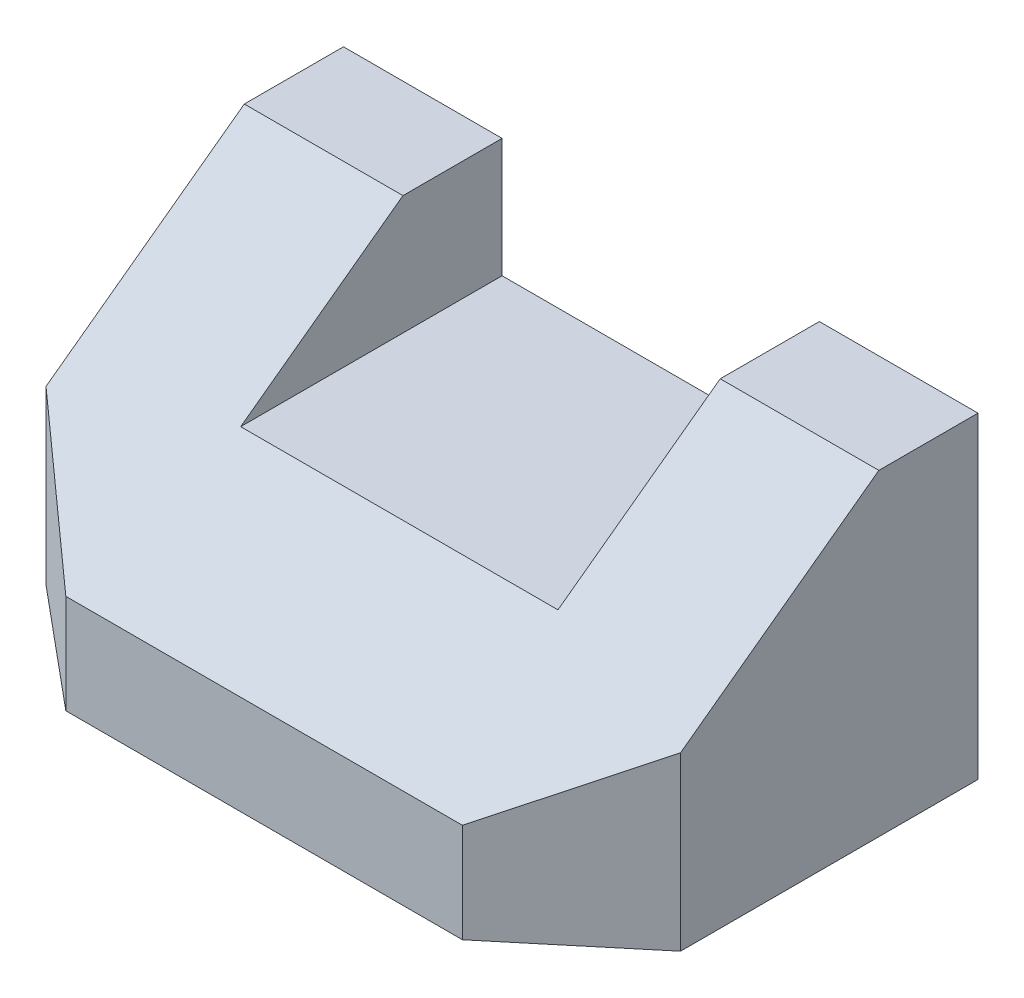
ISO-10303-21;
HEADER;
FILE_DESCRIPTION(('STEP AP214'),'2;1');
FILE_NAME('part.step','',(''),(''),'','','');
FILE_SCHEMA(('AUTOMOTIVE_DESIGN { 1 0 10303 214 1 1 1 1 }'));
ENDSEC;
DATA;
#1=APPLICATION_CONTEXT('core data for automotive mechanical design processes');
#2=APPLICATION_PROTOCOL_DEFINITION('international standard','automotive_design',2000,#1);
#3=PRODUCT_CONTEXT('',#1,'mechanical');
#4=PRODUCT('Part','Part','',(#3));
#5=PRODUCT_RELATED_PRODUCT_CATEGORY('part','',(#4));
#6=PRODUCT_DEFINITION_FORMATION('','',#4);
#7=PRODUCT_DEFINITION_CONTEXT('part definition',#1,'design');
#8=PRODUCT_DEFINITION('design','',#6,#7);
#9=PRODUCT_DEFINITION_SHAPE('','',#8);
#10=(LENGTH_UNIT() NAMED_UNIT(*) SI_UNIT(.MILLI.,.METRE.));
#11=(NAMED_UNIT(*) PLANE_ANGLE_UNIT() SI_UNIT($,.RADIAN.));
#12=(NAMED_UNIT(*) SI_UNIT($,.STERADIAN.) SOLID_ANGLE_UNIT());
#13=UNCERTAINTY_MEASURE_WITH_UNIT(LENGTH_MEASURE(1.E-05),#10,'distance_accuracy_value','');
#14=(GEOMETRIC_REPRESENTATION_CONTEXT(3) GLOBAL_UNCERTAINTY_ASSIGNED_CONTEXT((#13)) GLOBAL_UNIT_ASSIGNED_CONTEXT((#10,
#11,#12)) REPRESENTATION_CONTEXT('',''));
#15=CARTESIAN_POINT('',(0.,0.,0.));
#16=DIRECTION('',(0.,0.,1.));
#17=DIRECTION('',(1.,0.,0.));
#18=AXIS2_PLACEMENT_3D('',#15,#16,#17);
#19=CARTESIAN_POINT('',(32.,32.,-40.));
#20=DIRECTION('',(0.,0.,1.));
#21=DIRECTION('',(0.,-1.,0.));
#22=AXIS2_PLACEMENT_3D('',#19,#20,#21);
#23=PLANE('',#22);
#24=DIRECTION('',(0.,1.,0.));
#25=VECTOR('',#24,1.);
#26=CARTESIAN_POINT('',(-16.,32.,-40.));
#27=LINE('',#26,#25);
#28=CARTESIAN_POINT('',(-16.,20.,-40.));
#29=VERTEX_POINT('',#28);
#30=CARTESIAN_POINT('',(-16.,32.,-40.));
#31=VERTEX_POINT('',#30);
#32=EDGE_CURVE('E202',#29,#31,#27,.T.);
#33=ORIENTED_EDGE('',*,*,#32,.F.);
#34=DIRECTION('',(-1.,0.,0.));
#35=VECTOR('',#34,1.);
#36=CARTESIAN_POINT('',(-16.,20.,-40.));
#37=LINE('',#36,#35);
#38=CARTESIAN_POINT('',(16.,20.,-40.));
#39=VERTEX_POINT('',#38);
#40=EDGE_CURVE('E206',#39,#29,#37,.T.);
#41=ORIENTED_EDGE('',*,*,#40,.F.);
#42=DIRECTION('',(0.,-1.,0.));
#43=VECTOR('',#42,1.);
#44=CARTESIAN_POINT('',(16.,32.,-40.));
#45=LINE('',#44,#43);
#46=CARTESIAN_POINT('',(16.,32.,-40.));
#47=VERTEX_POINT('',#46);
#48=EDGE_CURVE('E204',#47,#39,#45,.T.);
#49=ORIENTED_EDGE('',*,*,#48,.F.);
#50=DIRECTION('',(-1.,0.,0.));
#51=VECTOR('',#50,1.);
#52=CARTESIAN_POINT('',(32.,32.,-40.));
#53=LINE('',#52,#51);
#54=CARTESIAN_POINT('',(32.,32.,-40.));
#55=VERTEX_POINT('',#54);
#56=EDGE_CURVE('E146',#55,#47,#53,.T.);
#57=ORIENTED_EDGE('',*,*,#56,.F.);
#58=DIRECTION('',(0.,1.,0.));
#59=VECTOR('',#58,1.);
#60=CARTESIAN_POINT('',(32.,32.,-40.));
#61=LINE('',#60,#59);
#62=CARTESIAN_POINT('',(32.,0.,-40.));
#63=VERTEX_POINT('',#62);
#64=EDGE_CURVE('E182',#63,#55,#61,.T.);
#65=ORIENTED_EDGE('',*,*,#64,.F.);
#66=DIRECTION('',(-1.,0.,0.));
#67=VECTOR('',#66,1.);
#68=CARTESIAN_POINT('',(32.,0.,-40.));
#69=LINE('',#68,#67);
#70=CARTESIAN_POINT('',(-32.,0.,-40.));
#71=VERTEX_POINT('',#70);
#72=EDGE_CURVE('E149',#63,#71,#69,.T.);
#73=ORIENTED_EDGE('',*,*,#72,.T.);
#74=DIRECTION('',(0.,1.,0.));
#75=VECTOR('',#74,1.);
#76=CARTESIAN_POINT('',(-32.,32.,-40.));
#77=LINE('',#76,#75);
#78=CARTESIAN_POINT('',(-32.,32.,-40.));
#79=VERTEX_POINT('',#78);
#80=EDGE_CURVE('E170',#71,#79,#77,.T.);
#81=ORIENTED_EDGE('',*,*,#80,.T.);
#82=EDGE_CURVE('E145',#31,#79,#53,.T.);
#83=ORIENTED_EDGE('',*,*,#82,.F.);
#84=EDGE_LOOP('',(#33,#41,#49,#57,#65,#73,#81,#83));
#85=FACE_BOUND('',#84,.T.);
#86=ADVANCED_FACE('F30',(#85),#23,.F.);
#87=CARTESIAN_POINT('',(32.,32.,-30.));
#88=DIRECTION('',(0.,-1.,0.));
#89=DIRECTION('',(0.,0.,-1.));
#90=AXIS2_PLACEMENT_3D('',#87,#88,#89);
#91=PLANE('',#90);
#92=DIRECTION('',(0.,0.,1.));
#93=VECTOR('',#92,1.);
#94=CARTESIAN_POINT('',(-16.,32.,-40.));
#95=LINE('',#94,#93);
#96=CARTESIAN_POINT('',(-16.,32.,-30.));
#97=VERTEX_POINT('',#96);
#98=EDGE_CURVE('E171',#31,#97,#95,.T.);
#99=ORIENTED_EDGE('',*,*,#98,.F.);
#100=ORIENTED_EDGE('',*,*,#82,.T.);
#101=DIRECTION('',(0.,0.,1.));
#102=VECTOR('',#101,1.);
#103=CARTESIAN_POINT('',(-32.,32.,-30.));
#104=LINE('',#103,#102);
#105=CARTESIAN_POINT('',(-32.,32.,-30.));
#106=VERTEX_POINT('',#105);
#107=EDGE_CURVE('E173',#79,#106,#104,.T.);
#108=ORIENTED_EDGE('',*,*,#107,.T.);
#109=DIRECTION('',(-1.,0.,0.));
#110=VECTOR('',#109,1.);
#111=CARTESIAN_POINT('',(32.,32.,-30.));
#112=LINE('',#111,#110);
#113=EDGE_CURVE('E133',#97,#106,#112,.T.);
#114=ORIENTED_EDGE('',*,*,#113,.F.);
#115=EDGE_LOOP('',(#99,#100,#108,#114));
#116=FACE_BOUND('',#115,.T.);
#117=ADVANCED_FACE('F227',(#116),#91,.F.);
#118=DIRECTION('',(0.,0.,1.));
#119=VECTOR('',#118,1.);
#120=CARTESIAN_POINT('',(16.,32.,-40.));
#121=LINE('',#120,#119);
#122=CARTESIAN_POINT('',(16.,32.,-30.));
#123=VERTEX_POINT('',#122);
#124=EDGE_CURVE('E175',#47,#123,#121,.T.);
#125=ORIENTED_EDGE('',*,*,#124,.T.);
#126=CARTESIAN_POINT('',(32.,32.,-30.));
#127=VERTEX_POINT('',#126);
#128=EDGE_CURVE('E142',#127,#123,#112,.T.);
#129=ORIENTED_EDGE('',*,*,#128,.F.);
#130=DIRECTION('',(0.,0.,1.));
#131=VECTOR('',#130,1.);
#132=CARTESIAN_POINT('',(32.,32.,-30.));
#133=LINE('',#132,#131);
#134=EDGE_CURVE('E136',#55,#127,#133,.T.);
#135=ORIENTED_EDGE('',*,*,#134,.F.);
#136=ORIENTED_EDGE('',*,*,#56,.T.);
#137=EDGE_LOOP('',(#125,#129,#135,#136));
#138=FACE_BOUND('',#137,.T.);
#139=ADVANCED_FACE('F195',(#138),#91,.F.);
#140=CARTESIAN_POINT('',(32.,10.,0.));
#141=DIRECTION('',(0.,-0.806404995855705,-0.591363663627517));
#142=DIRECTION('',(0.,0.591363663627517,-0.806404995855705));
#143=AXIS2_PLACEMENT_3D('',#140,#141,#142);
#144=PLANE('',#143);
#145=DIRECTION('',(-1.,0.,0.));
#146=VECTOR('',#145,1.);
#147=CARTESIAN_POINT('',(32.,10.,0.));
#148=LINE('',#147,#146);
#149=CARTESIAN_POINT('',(20.,10.,0.));
#150=VERTEX_POINT('',#149);
#151=CARTESIAN_POINT('',(-20.,10.,0.));
#152=VERTEX_POINT('',#151);
#153=EDGE_CURVE('E130',#150,#152,#148,.T.);
#154=ORIENTED_EDGE('',*,*,#153,.F.);
#155=DIRECTION('',(0.69540066835763,0.424967075107441,-0.579500556964692));
#156=VECTOR('',#155,1.);
#157=CARTESIAN_POINT('',(25.8029850746269,13.5462686567164,-4.83582089552239));
#158=LINE('',#157,#156);
#159=CARTESIAN_POINT('',(32.,17.3333333333333,-10.));
#160=VERTEX_POINT('',#159);
#161=EDGE_CURVE('E114',#150,#160,#158,.T.);
#162=ORIENTED_EDGE('',*,*,#161,.T.);
#163=DIRECTION('',(0.,-0.591363663627517,0.806404995855705));
#164=VECTOR('',#163,1.);
#165=CARTESIAN_POINT('',(32.,10.,0.));
#166=LINE('',#165,#164);
#167=EDGE_CURVE('E131',#127,#160,#166,.T.);
#168=ORIENTED_EDGE('',*,*,#167,.F.);
#169=ORIENTED_EDGE('',*,*,#128,.T.);
#170=DIRECTION('',(0.,0.591363663627517,-0.806404995855705));
#171=VECTOR('',#170,1.);
#172=CARTESIAN_POINT('',(16.,10.,0.));
#173=LINE('',#172,#171);
#174=CARTESIAN_POINT('',(16.,20.,-13.6363636363636));
#175=VERTEX_POINT('',#174);
#176=EDGE_CURVE('E154',#175,#123,#173,.T.);
#177=ORIENTED_EDGE('',*,*,#176,.F.);
#178=DIRECTION('',(1.,0.,0.));
#179=VECTOR('',#178,1.);
#180=CARTESIAN_POINT('',(32.,20.,-13.6363636363636));
#181=LINE('',#180,#179);
#182=CARTESIAN_POINT('',(-16.,20.,-13.6363636363636));
#183=VERTEX_POINT('',#182);
#184=EDGE_CURVE('E152',#183,#175,#181,.T.);
#185=ORIENTED_EDGE('',*,*,#184,.F.);
#186=DIRECTION('',(0.,-0.591363663627517,0.806404995855705));
#187=VECTOR('',#186,1.);
#188=CARTESIAN_POINT('',(-16.,10.,0.));
#189=LINE('',#188,#187);
#190=EDGE_CURVE('E156',#97,#183,#189,.T.);
#191=ORIENTED_EDGE('',*,*,#190,.F.);
#192=ORIENTED_EDGE('',*,*,#113,.T.);
#193=DIRECTION('',(0.,-0.591363663627517,0.806404995855705));
#194=VECTOR('',#193,1.);
#195=CARTESIAN_POINT('',(-32.,10.,0.));
#196=LINE('',#195,#194);
#197=CARTESIAN_POINT('',(-32.,17.3333333333333,-10.));
#198=VERTEX_POINT('',#197);
#199=EDGE_CURVE('E139',#106,#198,#196,.T.);
#200=ORIENTED_EDGE('',*,*,#199,.T.);
#201=DIRECTION('',(0.69540066835763,-0.424967075107441,0.579500556964692));
#202=VECTOR('',#201,1.);
#203=CARTESIAN_POINT('',(5.14626865671644,-5.36716417910448,20.955223880597));
#204=LINE('',#203,#202);
#205=EDGE_CURVE('E52',#198,#152,#204,.T.);
#206=ORIENTED_EDGE('',*,*,#205,.T.);
#207=EDGE_LOOP('',(#154,#162,#168,#169,#177,#185,#191,#192,#200,#206));
#208=FACE_BOUND('',#207,.T.);
#209=ADVANCED_FACE('F197',(#208),#144,.F.);
#210=CARTESIAN_POINT('',(32.,0.,-40.));
#211=DIRECTION('',(0.,1.,0.));
#212=DIRECTION('',(0.,0.,1.));
#213=AXIS2_PLACEMENT_3D('',#210,#211,#212);
#214=PLANE('',#213);
#215=DIRECTION('',(0.,0.,-1.));
#216=VECTOR('',#215,1.);
#217=CARTESIAN_POINT('',(32.,0.,-40.));
#218=LINE('',#217,#216);
#219=CARTESIAN_POINT('',(32.,0.,-10.));
#220=VERTEX_POINT('',#219);
#221=EDGE_CURVE('E125',#220,#63,#218,.T.);
#222=ORIENTED_EDGE('',*,*,#221,.F.);
#223=DIRECTION('',(0.768221279597376,0.,-0.64018439966448));
#224=VECTOR('',#223,1.);
#225=CARTESIAN_POINT('',(20.,0.,0.));
#226=LINE('',#225,#224);
#227=CARTESIAN_POINT('',(20.,0.,0.));
#228=VERTEX_POINT('',#227);
#229=EDGE_CURVE('E45',#228,#220,#226,.T.);
#230=ORIENTED_EDGE('',*,*,#229,.F.);
#231=DIRECTION('',(-1.,0.,0.));
#232=VECTOR('',#231,1.);
#233=CARTESIAN_POINT('',(32.,0.,0.));
#234=LINE('',#233,#232);
#235=CARTESIAN_POINT('',(-20.,0.,0.));
#236=VERTEX_POINT('',#235);
#237=EDGE_CURVE('E122',#228,#236,#234,.T.);
#238=ORIENTED_EDGE('',*,*,#237,.T.);
#239=DIRECTION('',(0.768221279597376,0.,0.64018439966448));
#240=VECTOR('',#239,1.);
#241=CARTESIAN_POINT('',(-20.,0.,0.));
#242=LINE('',#241,#240);
#243=CARTESIAN_POINT('',(-32.,0.,-10.));
#244=VERTEX_POINT('',#243);
#245=EDGE_CURVE('E159',#244,#236,#242,.T.);
#246=ORIENTED_EDGE('',*,*,#245,.F.);
#247=DIRECTION('',(0.,0.,-1.));
#248=VECTOR('',#247,1.);
#249=CARTESIAN_POINT('',(-32.,0.,-40.));
#250=LINE('',#249,#248);
#251=EDGE_CURVE('E164',#244,#71,#250,.T.);
#252=ORIENTED_EDGE('',*,*,#251,.T.);
#253=ORIENTED_EDGE('',*,*,#72,.F.);
#254=EDGE_LOOP('',(#222,#230,#238,#246,#252,#253));
#255=FACE_BOUND('',#254,.T.);
#256=ADVANCED_FACE('F32',(#255),#214,.F.);
#257=CARTESIAN_POINT('',(32.,0.,0.));
#258=DIRECTION('',(0.,0.,-1.));
#259=DIRECTION('',(-1.,0.,0.));
#260=AXIS2_PLACEMENT_3D('',#257,#258,#259);
#261=PLANE('',#260);
#262=ORIENTED_EDGE('',*,*,#237,.F.);
#263=DIRECTION('',(0.,-1.,0.));
#264=VECTOR('',#263,1.);
#265=CARTESIAN_POINT('',(20.,32.,0.));
#266=LINE('',#265,#264);
#267=EDGE_CURVE('E111',#150,#228,#266,.T.);
#268=ORIENTED_EDGE('',*,*,#267,.F.);
#269=ORIENTED_EDGE('',*,*,#153,.T.);
#270=DIRECTION('',(0.,-1.,0.));
#271=VECTOR('',#270,1.);
#272=CARTESIAN_POINT('',(-20.,32.,0.));
#273=LINE('',#272,#271);
#274=EDGE_CURVE('E129',#152,#236,#273,.T.);
#275=ORIENTED_EDGE('',*,*,#274,.T.);
#276=EDGE_LOOP('',(#262,#268,#269,#275));
#277=FACE_BOUND('',#276,.T.);
#278=ADVANCED_FACE('F128',(#277),#261,.F.);
#279=CARTESIAN_POINT('',(32.,0.,0.));
#280=DIRECTION('',(-1.,0.,0.));
#281=DIRECTION('',(0.,0.,1.));
#282=AXIS2_PLACEMENT_3D('',#279,#280,#281);
#283=PLANE('',#282);
#284=ORIENTED_EDGE('',*,*,#167,.T.);
#285=DIRECTION('',(0.,-1.,0.));
#286=VECTOR('',#285,1.);
#287=CARTESIAN_POINT('',(32.,0.,-10.));
#288=LINE('',#287,#286);
#289=EDGE_CURVE('E11',#160,#220,#288,.T.);
#290=ORIENTED_EDGE('',*,*,#289,.T.);
#291=ORIENTED_EDGE('',*,*,#221,.T.);
#292=ORIENTED_EDGE('',*,*,#64,.T.);
#293=ORIENTED_EDGE('',*,*,#134,.T.);
#294=EDGE_LOOP('',(#284,#290,#291,#292,#293));
#295=FACE_BOUND('',#294,.T.);
#296=ADVANCED_FACE('F190',(#295),#283,.F.);
#297=CARTESIAN_POINT('',(-32.,0.,0.));
#298=DIRECTION('',(-1.,0.,0.));
#299=DIRECTION('',(0.,0.,1.));
#300=AXIS2_PLACEMENT_3D('',#297,#298,#299);
#301=PLANE('',#300);
#302=DIRECTION('',(0.,-1.,0.));
#303=VECTOR('',#302,1.);
#304=CARTESIAN_POINT('',(-32.,0.,-10.));
#305=LINE('',#304,#303);
#306=EDGE_CURVE('E38',#198,#244,#305,.T.);
#307=ORIENTED_EDGE('',*,*,#306,.F.);
#308=ORIENTED_EDGE('',*,*,#199,.F.);
#309=ORIENTED_EDGE('',*,*,#107,.F.);
#310=ORIENTED_EDGE('',*,*,#80,.F.);
#311=ORIENTED_EDGE('',*,*,#251,.F.);
#312=EDGE_LOOP('',(#307,#308,#309,#310,#311));
#313=FACE_BOUND('',#312,.T.);
#314=ADVANCED_FACE('F167',(#313),#301,.T.);
#315=CARTESIAN_POINT('',(-16.,32.,-40.));
#316=DIRECTION('',(1.,0.,0.));
#317=DIRECTION('',(0.,0.,-1.));
#318=AXIS2_PLACEMENT_3D('',#315,#316,#317);
#319=PLANE('',#318);
#320=ORIENTED_EDGE('',*,*,#190,.T.);
#321=DIRECTION('',(0.,0.,1.));
#322=VECTOR('',#321,1.);
#323=CARTESIAN_POINT('',(-16.,20.,-40.));
#324=LINE('',#323,#322);
#325=EDGE_CURVE('E208',#29,#183,#324,.T.);
#326=ORIENTED_EDGE('',*,*,#325,.F.);
#327=ORIENTED_EDGE('',*,*,#32,.T.);
#328=ORIENTED_EDGE('',*,*,#98,.T.);
#329=EDGE_LOOP('',(#320,#326,#327,#328));
#330=FACE_BOUND('',#329,.T.);
#331=ADVANCED_FACE('F224',(#330),#319,.T.);
#332=CARTESIAN_POINT('',(16.,32.,-40.));
#333=DIRECTION('',(-1.,0.,0.));
#334=DIRECTION('',(0.,0.,1.));
#335=AXIS2_PLACEMENT_3D('',#332,#333,#334);
#336=PLANE('',#335);
#337=ORIENTED_EDGE('',*,*,#176,.T.);
#338=ORIENTED_EDGE('',*,*,#124,.F.);
#339=ORIENTED_EDGE('',*,*,#48,.T.);
#340=DIRECTION('',(0.,0.,1.));
#341=VECTOR('',#340,1.);
#342=CARTESIAN_POINT('',(16.,20.,-40.));
#343=LINE('',#342,#341);
#344=EDGE_CURVE('E210',#39,#175,#343,.T.);
#345=ORIENTED_EDGE('',*,*,#344,.T.);
#346=EDGE_LOOP('',(#337,#338,#339,#345));
#347=FACE_BOUND('',#346,.T.);
#348=ADVANCED_FACE('F214',(#347),#336,.T.);
#349=CARTESIAN_POINT('',(-16.,20.,-40.));
#350=DIRECTION('',(0.,1.,0.));
#351=DIRECTION('',(0.,0.,1.));
#352=AXIS2_PLACEMENT_3D('',#349,#350,#351);
#353=PLANE('',#352);
#354=ORIENTED_EDGE('',*,*,#184,.T.);
#355=ORIENTED_EDGE('',*,*,#344,.F.);
#356=ORIENTED_EDGE('',*,*,#40,.T.);
#357=ORIENTED_EDGE('',*,*,#325,.T.);
#358=EDGE_LOOP('',(#354,#355,#356,#357));
#359=FACE_BOUND('',#358,.T.);
#360=ADVANCED_FACE('F220',(#359),#353,.T.);
#361=CARTESIAN_POINT('',(-20.,32.,0.));
#362=DIRECTION('',(0.64018439966448,0.,-0.768221279597376));
#363=DIRECTION('',(-0.768221279597376,0.,-0.64018439966448));
#364=AXIS2_PLACEMENT_3D('',#361,#362,#363);
#365=PLANE('',#364);
#366=ORIENTED_EDGE('',*,*,#306,.T.);
#367=ORIENTED_EDGE('',*,*,#245,.T.);
#368=ORIENTED_EDGE('',*,*,#274,.F.);
#369=ORIENTED_EDGE('',*,*,#205,.F.);
#370=EDGE_LOOP('',(#366,#367,#368,#369));
#371=FACE_BOUND('',#370,.T.);
#372=ADVANCED_FACE('F158',(#371),#365,.F.);
#373=CARTESIAN_POINT('',(20.,32.,0.));
#374=DIRECTION('',(-0.64018439966448,0.,-0.768221279597376));
#375=DIRECTION('',(-0.768221279597376,0.,0.64018439966448));
#376=AXIS2_PLACEMENT_3D('',#373,#374,#375);
#377=PLANE('',#376);
#378=ORIENTED_EDGE('',*,*,#267,.T.);
#379=ORIENTED_EDGE('',*,*,#229,.T.);
#380=ORIENTED_EDGE('',*,*,#289,.F.);
#381=ORIENTED_EDGE('',*,*,#161,.F.);
#382=EDGE_LOOP('',(#378,#379,#380,#381));
#383=FACE_BOUND('',#382,.T.);
#384=ADVANCED_FACE('F112',(#383),#377,.F.);
#385=CLOSED_SHELL('',(#86,#117,#139,#209,#256,#278,#296,#314,#331,#348,#360,#372,#384));
#386=MANIFOLD_SOLID_BREP('B2',#385);
#387=ADVANCED_BREP_SHAPE_REPRESENTATION('',(#18,#386),#14);
#388=SHAPE_DEFINITION_REPRESENTATION(#9,#387);
ENDSEC;
END-ISO-10303-21;
